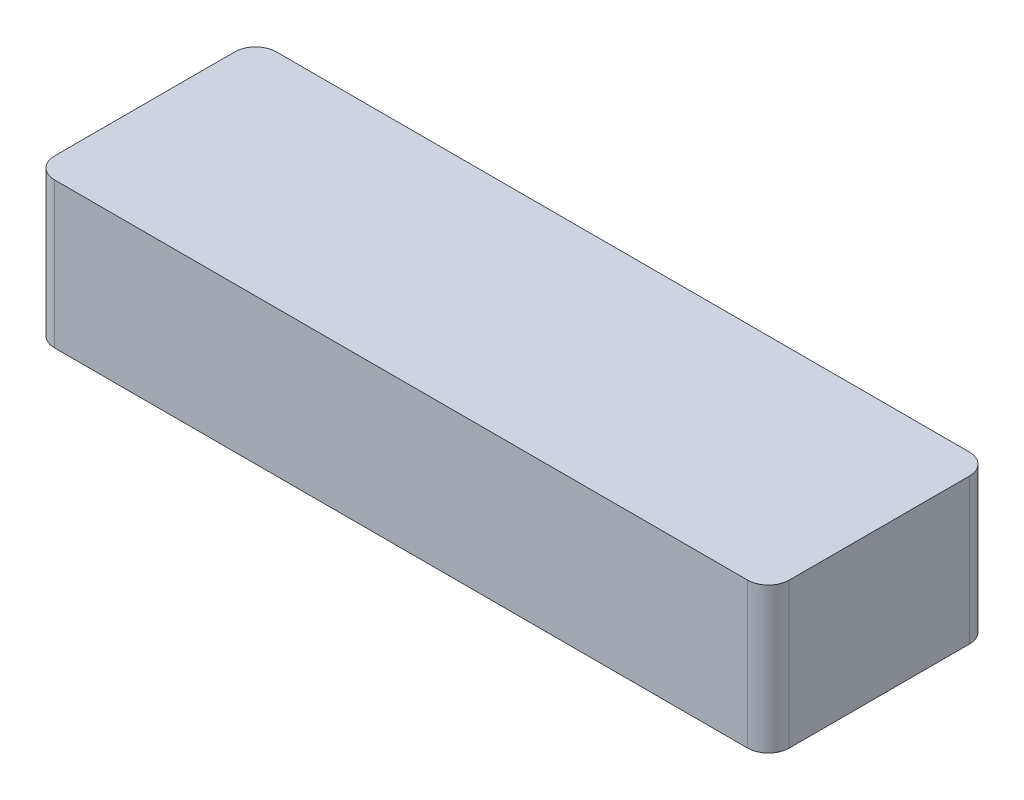
ISO-10303-21;
HEADER;
FILE_DESCRIPTION(('STEP AP214'),'2;1');
FILE_NAME('part.step','',(''),(''),'','','');
FILE_SCHEMA(('AUTOMOTIVE_DESIGN { 1 0 10303 214 1 1 1 1 }'));
ENDSEC;
DATA;
#1=APPLICATION_CONTEXT('core data for automotive mechanical design processes');
#2=APPLICATION_PROTOCOL_DEFINITION('international standard','automotive_design',2000,#1);
#3=PRODUCT_CONTEXT('',#1,'mechanical');
#4=PRODUCT('Part','Part','',(#3));
#5=PRODUCT_RELATED_PRODUCT_CATEGORY('part','',(#4));
#6=PRODUCT_DEFINITION_FORMATION('','',#4);
#7=PRODUCT_DEFINITION_CONTEXT('part definition',#1,'design');
#8=PRODUCT_DEFINITION('design','',#6,#7);
#9=PRODUCT_DEFINITION_SHAPE('','',#8);
#10=(LENGTH_UNIT() NAMED_UNIT(*) SI_UNIT(.MILLI.,.METRE.));
#11=(NAMED_UNIT(*) PLANE_ANGLE_UNIT() SI_UNIT($,.RADIAN.));
#12=(NAMED_UNIT(*) SI_UNIT($,.STERADIAN.) SOLID_ANGLE_UNIT());
#13=UNCERTAINTY_MEASURE_WITH_UNIT(LENGTH_MEASURE(1.E-05),#10,'distance_accuracy_value','');
#14=(GEOMETRIC_REPRESENTATION_CONTEXT(3) GLOBAL_UNCERTAINTY_ASSIGNED_CONTEXT((#13)) GLOBAL_UNIT_ASSIGNED_CONTEXT((#10,
#11,#12)) REPRESENTATION_CONTEXT('',''));
#15=CARTESIAN_POINT('',(0.,0.,0.));
#16=DIRECTION('',(0.,0.,1.));
#17=DIRECTION('',(1.,0.,0.));
#18=AXIS2_PLACEMENT_3D('',#15,#16,#17);
#19=CARTESIAN_POINT('',(-84.0592485549133,9.13439306358382,32.));
#20=DIRECTION('',(1.,0.,0.));
#21=DIRECTION('',(0.,0.,-1.));
#22=AXIS2_PLACEMENT_3D('',#19,#20,#21);
#23=PLANE('',#22);
#24=DIRECTION('',(0.,0.,-1.));
#25=VECTOR('',#24,1.);
#26=CARTESIAN_POINT('',(-84.0592485549133,-11.8656069364162,32.));
#27=LINE('',#26,#25);
#28=CARTESIAN_POINT('',(-84.0592485549133,-11.8656069364162,29.));
#29=VERTEX_POINT('',#28);
#30=CARTESIAN_POINT('',(-84.0592485549133,-11.8656069364162,3.));
#31=VERTEX_POINT('',#30);
#32=EDGE_CURVE('E143',#29,#31,#27,.T.);
#33=ORIENTED_EDGE('',*,*,#32,.F.);
#34=DIRECTION('',(0.,-1.,0.));
#35=VECTOR('',#34,1.);
#36=CARTESIAN_POINT('',(-84.0592485549133,9.13439306358382,29.));
#37=LINE('',#36,#35);
#38=CARTESIAN_POINT('',(-84.0592485549133,9.13439306358382,29.));
#39=VERTEX_POINT('',#38);
#40=EDGE_CURVE('E104',#29,#39,#37,.F.);
#41=ORIENTED_EDGE('',*,*,#40,.T.);
#42=DIRECTION('',(0.,0.,-1.));
#43=VECTOR('',#42,1.);
#44=CARTESIAN_POINT('',(-84.0592485549133,9.13439306358382,32.));
#45=LINE('',#44,#43);
#46=CARTESIAN_POINT('',(-84.0592485549133,9.13439306358382,3.));
#47=VERTEX_POINT('',#46);
#48=EDGE_CURVE('E128',#39,#47,#45,.T.);
#49=ORIENTED_EDGE('',*,*,#48,.T.);
#50=DIRECTION('',(0.,-1.,0.));
#51=VECTOR('',#50,1.);
#52=CARTESIAN_POINT('',(-84.0592485549133,9.13439306358382,3.));
#53=LINE('',#52,#51);
#54=EDGE_CURVE('E109',#47,#31,#53,.T.);
#55=ORIENTED_EDGE('',*,*,#54,.T.);
#56=EDGE_LOOP('',(#33,#41,#49,#55));
#57=FACE_BOUND('',#56,.T.);
#58=ADVANCED_FACE('F33',(#57),#23,.F.);
#59=CARTESIAN_POINT('',(-84.0592485549133,-11.8656069364162,32.));
#60=DIRECTION('',(0.,1.,0.));
#61=DIRECTION('',(0.,0.,1.));
#62=AXIS2_PLACEMENT_3D('',#59,#60,#61);
#63=PLANE('',#62);
#64=DIRECTION('',(1.,0.,0.));
#65=VECTOR('',#64,1.);
#66=CARTESIAN_POINT('',(-84.0592485549133,-11.8656069364162,32.));
#67=LINE('',#66,#65);
#68=CARTESIAN_POINT('',(-81.0592485549133,-11.8656069364162,32.));
#69=VERTEX_POINT('',#68);
#70=CARTESIAN_POINT('',(18.9407514450867,-11.8656069364162,32.));
#71=VERTEX_POINT('',#70);
#72=EDGE_CURVE('E117',#69,#71,#67,.T.);
#73=ORIENTED_EDGE('',*,*,#72,.F.);
#74=CARTESIAN_POINT('',(-81.0592485549133,-11.8656069364162,29.));
#75=DIRECTION('',(0.,1.,0.));
#76=DIRECTION('',(0.,0.,1.));
#77=AXIS2_PLACEMENT_3D('',#74,#75,#76);
#78=CIRCLE('',#77,3.);
#79=EDGE_CURVE('E99',#69,#29,#78,.F.);
#80=ORIENTED_EDGE('',*,*,#79,.T.);
#81=ORIENTED_EDGE('',*,*,#32,.T.);
#82=CARTESIAN_POINT('',(-81.0592485549133,-11.8656069364162,3.));
#83=DIRECTION('',(0.,1.,0.));
#84=DIRECTION('',(0.,0.,1.));
#85=AXIS2_PLACEMENT_3D('',#82,#83,#84);
#86=CIRCLE('',#85,3.);
#87=CARTESIAN_POINT('',(-81.0592485549133,-11.8656069364162,0.));
#88=VERTEX_POINT('',#87);
#89=EDGE_CURVE('E110',#31,#88,#86,.F.);
#90=ORIENTED_EDGE('',*,*,#89,.T.);
#91=DIRECTION('',(1.,0.,0.));
#92=VECTOR('',#91,1.);
#93=CARTESIAN_POINT('',(-84.0592485549133,-11.8656069364162,0.));
#94=LINE('',#93,#92);
#95=CARTESIAN_POINT('',(18.9407514450867,-11.8656069364162,0.));
#96=VERTEX_POINT('',#95);
#97=EDGE_CURVE('E131',#88,#96,#94,.T.);
#98=ORIENTED_EDGE('',*,*,#97,.T.);
#99=CARTESIAN_POINT('',(18.9407514450867,-11.8656069364162,3.));
#100=DIRECTION('',(0.,1.,0.));
#101=DIRECTION('',(0.,0.,1.));
#102=AXIS2_PLACEMENT_3D('',#99,#100,#101);
#103=CIRCLE('',#102,3.);
#104=CARTESIAN_POINT('',(21.9407514450867,-11.8656069364162,3.));
#105=VERTEX_POINT('',#104);
#106=EDGE_CURVE('E147',#96,#105,#103,.F.);
#107=ORIENTED_EDGE('',*,*,#106,.T.);
#108=DIRECTION('',(0.,0.,-1.));
#109=VECTOR('',#108,1.);
#110=CARTESIAN_POINT('',(21.9407514450867,-11.8656069364162,32.));
#111=LINE('',#110,#109);
#112=CARTESIAN_POINT('',(21.9407514450867,-11.8656069364162,29.));
#113=VERTEX_POINT('',#112);
#114=EDGE_CURVE('E140',#113,#105,#111,.T.);
#115=ORIENTED_EDGE('',*,*,#114,.F.);
#116=CARTESIAN_POINT('',(18.9407514450867,-11.8656069364162,29.));
#117=DIRECTION('',(0.,1.,0.));
#118=DIRECTION('',(0.,0.,1.));
#119=AXIS2_PLACEMENT_3D('',#116,#117,#118);
#120=CIRCLE('',#119,3.);
#121=EDGE_CURVE('E120',#113,#71,#120,.F.);
#122=ORIENTED_EDGE('',*,*,#121,.T.);
#123=EDGE_LOOP('',(#73,#80,#81,#90,#98,#107,#115,#122));
#124=FACE_BOUND('',#123,.T.);
#125=ADVANCED_FACE('F123',(#124),#63,.F.);
#126=CARTESIAN_POINT('',(21.9407514450867,9.13439306358382,32.));
#127=DIRECTION('',(-1.,0.,0.));
#128=DIRECTION('',(0.,0.,1.));
#129=AXIS2_PLACEMENT_3D('',#126,#127,#128);
#130=PLANE('',#129);
#131=ORIENTED_EDGE('',*,*,#114,.T.);
#132=DIRECTION('',(0.,1.,0.));
#133=VECTOR('',#132,1.);
#134=CARTESIAN_POINT('',(21.9407514450867,9.13439306358382,3.));
#135=LINE('',#134,#133);
#136=CARTESIAN_POINT('',(21.9407514450867,9.13439306358382,3.));
#137=VERTEX_POINT('',#136);
#138=EDGE_CURVE('E11',#105,#137,#135,.T.);
#139=ORIENTED_EDGE('',*,*,#138,.T.);
#140=DIRECTION('',(0.,0.,-1.));
#141=VECTOR('',#140,1.);
#142=CARTESIAN_POINT('',(21.9407514450867,9.13439306358382,32.));
#143=LINE('',#142,#141);
#144=CARTESIAN_POINT('',(21.9407514450867,9.13439306358382,29.));
#145=VERTEX_POINT('',#144);
#146=EDGE_CURVE('E138',#145,#137,#143,.T.);
#147=ORIENTED_EDGE('',*,*,#146,.F.);
#148=DIRECTION('',(0.,1.,0.));
#149=VECTOR('',#148,1.);
#150=CARTESIAN_POINT('',(21.9407514450867,-11.8656069364162,29.));
#151=LINE('',#150,#149);
#152=EDGE_CURVE('E41',#145,#113,#151,.F.);
#153=ORIENTED_EDGE('',*,*,#152,.T.);
#154=EDGE_LOOP('',(#131,#139,#147,#153));
#155=FACE_BOUND('',#154,.T.);
#156=ADVANCED_FACE('F164',(#155),#130,.F.);
#157=CARTESIAN_POINT('',(-84.0592485549133,9.13439306358382,32.));
#158=DIRECTION('',(0.,-1.,0.));
#159=DIRECTION('',(0.,0.,-1.));
#160=AXIS2_PLACEMENT_3D('',#157,#158,#159);
#161=PLANE('',#160);
#162=ORIENTED_EDGE('',*,*,#48,.F.);
#163=CARTESIAN_POINT('',(-81.0592485549133,9.13439306358382,29.));
#164=DIRECTION('',(0.,-1.,0.));
#165=DIRECTION('',(0.,0.,-1.));
#166=AXIS2_PLACEMENT_3D('',#163,#164,#165);
#167=CIRCLE('',#166,3.);
#168=CARTESIAN_POINT('',(-81.0592485549133,9.13439306358382,32.));
#169=VERTEX_POINT('',#168);
#170=EDGE_CURVE('E157',#39,#169,#167,.F.);
#171=ORIENTED_EDGE('',*,*,#170,.T.);
#172=DIRECTION('',(-1.,0.,0.));
#173=VECTOR('',#172,1.);
#174=CARTESIAN_POINT('',(-84.0592485549133,9.13439306358382,32.));
#175=LINE('',#174,#173);
#176=CARTESIAN_POINT('',(18.9407514450867,9.13439306358382,32.));
#177=VERTEX_POINT('',#176);
#178=EDGE_CURVE('E119',#177,#169,#175,.T.);
#179=ORIENTED_EDGE('',*,*,#178,.F.);
#180=CARTESIAN_POINT('',(18.9407514450867,9.13439306358382,29.));
#181=DIRECTION('',(0.,-1.,0.));
#182=DIRECTION('',(0.,0.,-1.));
#183=AXIS2_PLACEMENT_3D('',#180,#181,#182);
#184=CIRCLE('',#183,3.);
#185=EDGE_CURVE('E55',#177,#145,#184,.F.);
#186=ORIENTED_EDGE('',*,*,#185,.T.);
#187=ORIENTED_EDGE('',*,*,#146,.T.);
#188=CARTESIAN_POINT('',(18.9407514450867,9.13439306358382,3.));
#189=DIRECTION('',(0.,-1.,0.));
#190=DIRECTION('',(0.,0.,-1.));
#191=AXIS2_PLACEMENT_3D('',#188,#189,#190);
#192=CIRCLE('',#191,3.);
#193=CARTESIAN_POINT('',(18.9407514450867,9.13439306358382,0.));
#194=VERTEX_POINT('',#193);
#195=EDGE_CURVE('E48',#137,#194,#192,.F.);
#196=ORIENTED_EDGE('',*,*,#195,.T.);
#197=DIRECTION('',(-1.,0.,0.));
#198=VECTOR('',#197,1.);
#199=CARTESIAN_POINT('',(-84.0592485549133,9.13439306358382,0.));
#200=LINE('',#199,#198);
#201=CARTESIAN_POINT('',(-81.0592485549133,9.13439306358382,0.));
#202=VERTEX_POINT('',#201);
#203=EDGE_CURVE('E126',#194,#202,#200,.T.);
#204=ORIENTED_EDGE('',*,*,#203,.T.);
#205=CARTESIAN_POINT('',(-81.0592485549133,9.13439306358382,3.));
#206=DIRECTION('',(0.,-1.,0.));
#207=DIRECTION('',(0.,0.,-1.));
#208=AXIS2_PLACEMENT_3D('',#205,#206,#207);
#209=CIRCLE('',#208,3.);
#210=EDGE_CURVE('E155',#202,#47,#209,.F.);
#211=ORIENTED_EDGE('',*,*,#210,.T.);
#212=EDGE_LOOP('',(#162,#171,#179,#186,#187,#196,#204,#211));
#213=FACE_BOUND('',#212,.T.);
#214=ADVANCED_FACE('F168',(#213),#161,.F.);
#215=CARTESIAN_POINT('',(0.,0.,32.));
#216=DIRECTION('',(0.,0.,1.));
#217=DIRECTION('',(1.,0.,0.));
#218=AXIS2_PLACEMENT_3D('',#215,#216,#217);
#219=PLANE('',#218);
#220=ORIENTED_EDGE('',*,*,#178,.T.);
#221=DIRECTION('',(0.,-1.,0.));
#222=VECTOR('',#221,1.);
#223=CARTESIAN_POINT('',(-81.0592485549133,-11.8656069364162,32.));
#224=LINE('',#223,#222);
#225=EDGE_CURVE('E103',#169,#69,#224,.T.);
#226=ORIENTED_EDGE('',*,*,#225,.T.);
#227=ORIENTED_EDGE('',*,*,#72,.T.);
#228=DIRECTION('',(0.,1.,0.));
#229=VECTOR('',#228,1.);
#230=CARTESIAN_POINT('',(18.9407514450867,9.13439306358382,32.));
#231=LINE('',#230,#229);
#232=EDGE_CURVE('E121',#71,#177,#231,.T.);
#233=ORIENTED_EDGE('',*,*,#232,.T.);
#234=EDGE_LOOP('',(#220,#226,#227,#233));
#235=FACE_BOUND('',#234,.T.);
#236=ADVANCED_FACE('F115',(#235),#219,.T.);
#237=CARTESIAN_POINT('',(0.,0.,0.));
#238=DIRECTION('',(0.,0.,1.));
#239=DIRECTION('',(1.,0.,0.));
#240=AXIS2_PLACEMENT_3D('',#237,#238,#239);
#241=PLANE('',#240);
#242=ORIENTED_EDGE('',*,*,#97,.F.);
#243=DIRECTION('',(0.,-1.,0.));
#244=VECTOR('',#243,1.);
#245=CARTESIAN_POINT('',(-81.0592485549133,0.,0.));
#246=LINE('',#245,#244);
#247=EDGE_CURVE('E161',#88,#202,#246,.F.);
#248=ORIENTED_EDGE('',*,*,#247,.T.);
#249=ORIENTED_EDGE('',*,*,#203,.F.);
#250=DIRECTION('',(0.,1.,0.));
#251=VECTOR('',#250,1.);
#252=CARTESIAN_POINT('',(18.9407514450867,0.,0.));
#253=LINE('',#252,#251);
#254=EDGE_CURVE('E159',#194,#96,#253,.F.);
#255=ORIENTED_EDGE('',*,*,#254,.T.);
#256=EDGE_LOOP('',(#242,#248,#249,#255));
#257=FACE_BOUND('',#256,.T.);
#258=ADVANCED_FACE('F177',(#257),#241,.F.);
#259=CARTESIAN_POINT('',(-81.0592485549133,0.,29.));
#260=DIRECTION('',(0.,1.,0.));
#261=DIRECTION('',(0.,0.,1.));
#262=AXIS2_PLACEMENT_3D('',#259,#260,#261);
#263=CYLINDRICAL_SURFACE('',#262,3.);
#264=ORIENTED_EDGE('',*,*,#170,.F.);
#265=ORIENTED_EDGE('',*,*,#40,.F.);
#266=ORIENTED_EDGE('',*,*,#79,.F.);
#267=ORIENTED_EDGE('',*,*,#225,.F.);
#268=EDGE_LOOP('',(#264,#265,#266,#267));
#269=FACE_BOUND('',#268,.T.);
#270=ADVANCED_FACE('F102',(#269),#263,.T.);
#271=CARTESIAN_POINT('',(-81.0592485549133,9.13439306358382,3.));
#272=DIRECTION('',(0.,-1.,0.));
#273=DIRECTION('',(0.,0.,-1.));
#274=AXIS2_PLACEMENT_3D('',#271,#272,#273);
#275=CYLINDRICAL_SURFACE('',#274,3.);
#276=ORIENTED_EDGE('',*,*,#210,.F.);
#277=ORIENTED_EDGE('',*,*,#247,.F.);
#278=ORIENTED_EDGE('',*,*,#89,.F.);
#279=ORIENTED_EDGE('',*,*,#54,.F.);
#280=EDGE_LOOP('',(#276,#277,#278,#279));
#281=FACE_BOUND('',#280,.T.);
#282=ADVANCED_FACE('F173',(#281),#275,.T.);
#283=CARTESIAN_POINT('',(18.9407514450867,9.13439306358382,3.));
#284=DIRECTION('',(0.,1.,0.));
#285=DIRECTION('',(0.,0.,1.));
#286=AXIS2_PLACEMENT_3D('',#283,#284,#285);
#287=CYLINDRICAL_SURFACE('',#286,3.);
#288=ORIENTED_EDGE('',*,*,#106,.F.);
#289=ORIENTED_EDGE('',*,*,#254,.F.);
#290=ORIENTED_EDGE('',*,*,#195,.F.);
#291=ORIENTED_EDGE('',*,*,#138,.F.);
#292=EDGE_LOOP('',(#288,#289,#290,#291));
#293=FACE_BOUND('',#292,.T.);
#294=ADVANCED_FACE('F179',(#293),#287,.T.);
#295=CARTESIAN_POINT('',(18.9407514450867,0.,29.));
#296=DIRECTION('',(0.,-1.,0.));
#297=DIRECTION('',(0.,0.,-1.));
#298=AXIS2_PLACEMENT_3D('',#295,#296,#297);
#299=CYLINDRICAL_SURFACE('',#298,3.);
#300=ORIENTED_EDGE('',*,*,#121,.F.);
#301=ORIENTED_EDGE('',*,*,#152,.F.);
#302=ORIENTED_EDGE('',*,*,#185,.F.);
#303=ORIENTED_EDGE('',*,*,#232,.F.);
#304=EDGE_LOOP('',(#300,#301,#302,#303));
#305=FACE_BOUND('',#304,.T.);
#306=ADVANCED_FACE('F35',(#305),#299,.T.);
#307=CLOSED_SHELL('',(#58,#125,#156,#214,#236,#258,#270,#282,#294,#306));
#308=MANIFOLD_SOLID_BREP('B2',#307);
#309=ADVANCED_BREP_SHAPE_REPRESENTATION('',(#18,#308),#14);
#310=SHAPE_DEFINITION_REPRESENTATION(#9,#309);
ENDSEC;
END-ISO-10303-21;
